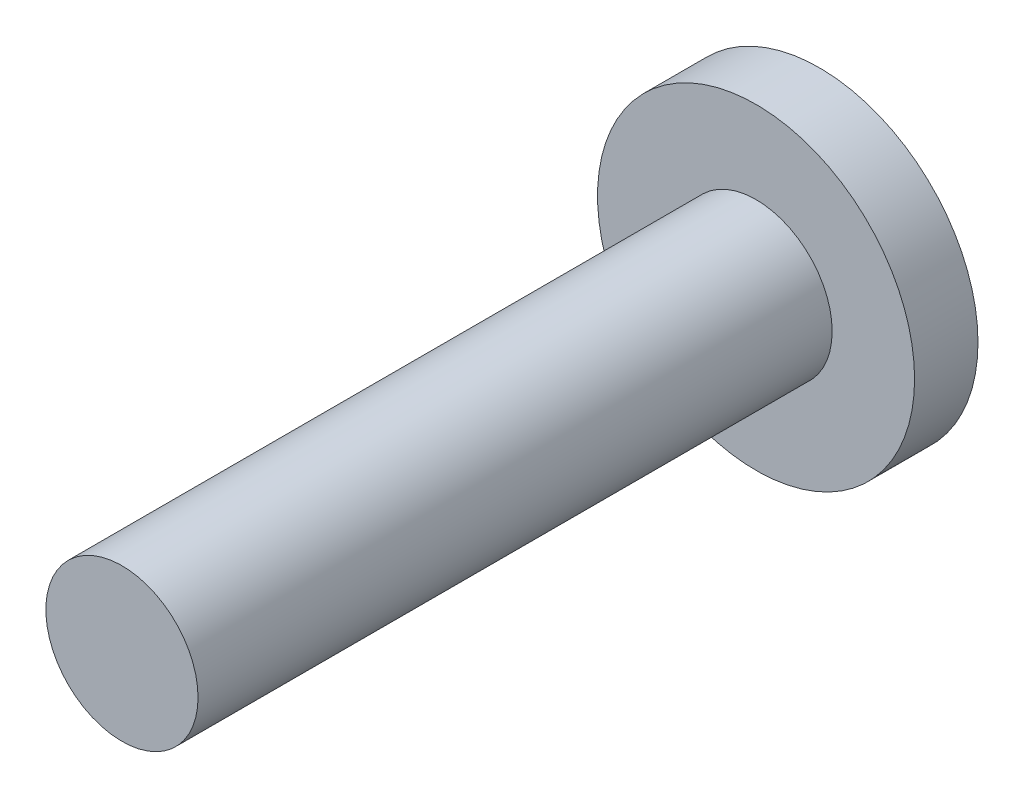
ISO-10303-21;
HEADER;
FILE_DESCRIPTION(('STEP AP214'),'2;1');
FILE_NAME('part.step','',(''),(''),'','','');
FILE_SCHEMA(('AUTOMOTIVE_DESIGN { 1 0 10303 214 1 1 1 1 }'));
ENDSEC;
DATA;
#1=APPLICATION_CONTEXT('core data for automotive mechanical design processes');
#2=APPLICATION_PROTOCOL_DEFINITION('international standard','automotive_design',2000,#1);
#3=PRODUCT_CONTEXT('',#1,'mechanical');
#4=PRODUCT('Part','Part','',(#3));
#5=PRODUCT_RELATED_PRODUCT_CATEGORY('part','',(#4));
#6=PRODUCT_DEFINITION_FORMATION('','',#4);
#7=PRODUCT_DEFINITION_CONTEXT('part definition',#1,'design');
#8=PRODUCT_DEFINITION('design','',#6,#7);
#9=PRODUCT_DEFINITION_SHAPE('','',#8);
#10=(LENGTH_UNIT() NAMED_UNIT(*) SI_UNIT(.MILLI.,.METRE.));
#11=(NAMED_UNIT(*) PLANE_ANGLE_UNIT() SI_UNIT($,.RADIAN.));
#12=(NAMED_UNIT(*) SI_UNIT($,.STERADIAN.) SOLID_ANGLE_UNIT());
#13=UNCERTAINTY_MEASURE_WITH_UNIT(LENGTH_MEASURE(1.E-05),#10,'distance_accuracy_value','');
#14=(GEOMETRIC_REPRESENTATION_CONTEXT(3) GLOBAL_UNCERTAINTY_ASSIGNED_CONTEXT((#13)) GLOBAL_UNIT_ASSIGNED_CONTEXT((#10,
#11,#12)) REPRESENTATION_CONTEXT('',''));
#15=CARTESIAN_POINT('',(0.,0.,0.));
#16=DIRECTION('',(0.,0.,1.));
#17=DIRECTION('',(1.,0.,0.));
#18=AXIS2_PLACEMENT_3D('',#15,#16,#17);
#19=CARTESIAN_POINT('',(0.,0.,2.5));
#20=DIRECTION('',(0.,0.,-1.));
#21=DIRECTION('',(-1.,0.,0.));
#22=AXIS2_PLACEMENT_3D('',#19,#20,#21);
#23=CYLINDRICAL_SURFACE('',#22,6.25);
#24=CARTESIAN_POINT('',(0.,0.,2.5));
#25=DIRECTION('',(0.,0.,1.));
#26=DIRECTION('',(1.,0.,0.));
#27=AXIS2_PLACEMENT_3D('',#24,#25,#26);
#28=CIRCLE('',#27,6.25);
#29=CARTESIAN_POINT('',(6.25,0.,2.5));
#30=VERTEX_POINT('',#29);
#31=EDGE_CURVE('E48',#30,#30,#28,.T.);
#32=ORIENTED_EDGE('',*,*,#31,.F.);
#33=EDGE_LOOP('',(#32));
#34=FACE_BOUND('',#33,.T.);
#35=CARTESIAN_POINT('',(0.,0.,0.));
#36=DIRECTION('',(0.,0.,1.));
#37=DIRECTION('',(1.,0.,0.));
#38=AXIS2_PLACEMENT_3D('',#35,#36,#37);
#39=CIRCLE('',#38,6.25);
#40=CARTESIAN_POINT('',(6.25,0.,0.));
#41=VERTEX_POINT('',#40);
#42=EDGE_CURVE('E43',#41,#41,#39,.T.);
#43=ORIENTED_EDGE('',*,*,#42,.T.);
#44=EDGE_LOOP('',(#43));
#45=FACE_BOUND('',#44,.T.);
#46=ADVANCED_FACE('F40',(#34,#45),#23,.T.);
#47=CARTESIAN_POINT('',(0.,0.,2.5));
#48=DIRECTION('',(0.,0.,1.));
#49=DIRECTION('',(1.,0.,0.));
#50=AXIS2_PLACEMENT_3D('',#47,#48,#49);
#51=PLANE('',#50);
#52=CARTESIAN_POINT('',(0.,0.,2.5));
#53=DIRECTION('',(0.,0.,1.));
#54=DIRECTION('',(1.,0.,0.));
#55=AXIS2_PLACEMENT_3D('',#52,#53,#54);
#56=CIRCLE('',#55,3.);
#57=CARTESIAN_POINT('',(3.,0.,2.5));
#58=VERTEX_POINT('',#57);
#59=EDGE_CURVE('E11',#58,#58,#56,.T.);
#60=ORIENTED_EDGE('',*,*,#59,.F.);
#61=EDGE_LOOP('',(#60));
#62=FACE_BOUND('',#61,.T.);
#63=ORIENTED_EDGE('',*,*,#31,.T.);
#64=EDGE_LOOP('',(#63));
#65=FACE_BOUND('',#64,.T.);
#66=ADVANCED_FACE('F160',(#62,#65),#51,.T.);
#67=CARTESIAN_POINT('',(0.,0.,0.));
#68=DIRECTION('',(0.,0.,1.));
#69=DIRECTION('',(1.,0.,0.));
#70=AXIS2_PLACEMENT_3D('',#67,#68,#69);
#71=PLANE('',#70);
#72=DIRECTION('',(0.5,0.866025403784439,0.));
#73=VECTOR('',#72,1.);
#74=CARTESIAN_POINT('',(-2.3094010767585,0.,0.));
#75=LINE('',#74,#73);
#76=CARTESIAN_POINT('',(-2.3094010767585,0.,0.));
#77=VERTEX_POINT('',#76);
#78=CARTESIAN_POINT('',(-1.15470053837925,2.,0.));
#79=VERTEX_POINT('',#78);
#80=EDGE_CURVE('E130',#77,#79,#75,.T.);
#81=ORIENTED_EDGE('',*,*,#80,.F.);
#82=DIRECTION('',(-0.5,0.866025403784439,0.));
#83=VECTOR('',#82,1.);
#84=CARTESIAN_POINT('',(-1.15470053837925,-2.,0.));
#85=LINE('',#84,#83);
#86=CARTESIAN_POINT('',(-1.15470053837925,-2.,0.));
#87=VERTEX_POINT('',#86);
#88=EDGE_CURVE('E56',#87,#77,#85,.T.);
#89=ORIENTED_EDGE('',*,*,#88,.F.);
#90=DIRECTION('',(-1.,0.,0.));
#91=VECTOR('',#90,1.);
#92=CARTESIAN_POINT('',(1.15470053837925,-2.,0.));
#93=LINE('',#92,#91);
#94=CARTESIAN_POINT('',(1.15470053837925,-2.,0.));
#95=VERTEX_POINT('',#94);
#96=EDGE_CURVE('E139',#95,#87,#93,.T.);
#97=ORIENTED_EDGE('',*,*,#96,.F.);
#98=DIRECTION('',(-0.5,-0.866025403784439,0.));
#99=VECTOR('',#98,1.);
#100=CARTESIAN_POINT('',(2.3094010767585,0.,0.));
#101=LINE('',#100,#99);
#102=CARTESIAN_POINT('',(2.3094010767585,0.,0.));
#103=VERTEX_POINT('',#102);
#104=EDGE_CURVE('E137',#103,#95,#101,.T.);
#105=ORIENTED_EDGE('',*,*,#104,.F.);
#106=DIRECTION('',(0.5,-0.866025403784439,0.));
#107=VECTOR('',#106,1.);
#108=CARTESIAN_POINT('',(1.15470053837925,2.,0.));
#109=LINE('',#108,#107);
#110=CARTESIAN_POINT('',(1.15470053837925,2.,0.));
#111=VERTEX_POINT('',#110);
#112=EDGE_CURVE('E104',#111,#103,#109,.T.);
#113=ORIENTED_EDGE('',*,*,#112,.F.);
#114=DIRECTION('',(1.,0.,0.));
#115=VECTOR('',#114,1.);
#116=CARTESIAN_POINT('',(-1.15470053837925,2.,0.));
#117=LINE('',#116,#115);
#118=EDGE_CURVE('E133',#79,#111,#117,.T.);
#119=ORIENTED_EDGE('',*,*,#118,.F.);
#120=EDGE_LOOP('',(#81,#89,#97,#105,#113,#119));
#121=FACE_BOUND('',#120,.T.);
#122=ORIENTED_EDGE('',*,*,#42,.F.);
#123=EDGE_LOOP('',(#122));
#124=FACE_BOUND('',#123,.T.);
#125=ADVANCED_FACE('F157',(#121,#124),#71,.F.);
#126=CARTESIAN_POINT('',(0.,0.,27.5));
#127=DIRECTION('',(0.,0.,-1.));
#128=DIRECTION('',(-1.,0.,0.));
#129=AXIS2_PLACEMENT_3D('',#126,#127,#128);
#130=CYLINDRICAL_SURFACE('',#129,3.);
#131=CARTESIAN_POINT('',(0.,0.,27.5));
#132=DIRECTION('',(0.,0.,1.));
#133=DIRECTION('',(1.,0.,0.));
#134=AXIS2_PLACEMENT_3D('',#131,#132,#133);
#135=CIRCLE('',#134,3.);
#136=CARTESIAN_POINT('',(3.,0.,27.5));
#137=VERTEX_POINT('',#136);
#138=EDGE_CURVE('E143',#137,#137,#135,.T.);
#139=ORIENTED_EDGE('',*,*,#138,.F.);
#140=EDGE_LOOP('',(#139));
#141=FACE_BOUND('',#140,.T.);
#142=ORIENTED_EDGE('',*,*,#59,.T.);
#143=EDGE_LOOP('',(#142));
#144=FACE_BOUND('',#143,.T.);
#145=ADVANCED_FACE('F159',(#141,#144),#130,.T.);
#146=CARTESIAN_POINT('',(0.,0.,27.5));
#147=DIRECTION('',(0.,0.,1.));
#148=DIRECTION('',(1.,0.,0.));
#149=AXIS2_PLACEMENT_3D('',#146,#147,#148);
#150=PLANE('',#149);
#151=ORIENTED_EDGE('',*,*,#138,.T.);
#152=EDGE_LOOP('',(#151));
#153=FACE_BOUND('',#152,.T.);
#154=ADVANCED_FACE('F167',(#153),#150,.T.);
#155=CARTESIAN_POINT('',(-1.15470053837925,-2.,1.));
#156=DIRECTION('',(-0.866025403784439,-0.5,0.));
#157=DIRECTION('',(0.5,-0.866025403784439,0.));
#158=AXIS2_PLACEMENT_3D('',#155,#156,#157);
#159=PLANE('',#158);
#160=ORIENTED_EDGE('',*,*,#88,.T.);
#161=DIRECTION('',(0.,0.,-1.));
#162=VECTOR('',#161,1.);
#163=CARTESIAN_POINT('',(-2.3094010767585,0.,1.));
#164=LINE('',#163,#162);
#165=CARTESIAN_POINT('',(-2.3094010767585,0.,1.));
#166=VERTEX_POINT('',#165);
#167=EDGE_CURVE('E86',#166,#77,#164,.T.);
#168=ORIENTED_EDGE('',*,*,#167,.F.);
#169=DIRECTION('',(-0.5,0.866025403784439,0.));
#170=VECTOR('',#169,1.);
#171=CARTESIAN_POINT('',(-1.15470053837925,-2.,1.));
#172=LINE('',#171,#170);
#173=CARTESIAN_POINT('',(-1.15470053837925,-2.,1.));
#174=VERTEX_POINT('',#173);
#175=EDGE_CURVE('E141',#174,#166,#172,.T.);
#176=ORIENTED_EDGE('',*,*,#175,.F.);
#177=DIRECTION('',(0.,0.,-1.));
#178=VECTOR('',#177,1.);
#179=CARTESIAN_POINT('',(-1.15470053837925,-2.,1.));
#180=LINE('',#179,#178);
#181=EDGE_CURVE('E64',#174,#87,#180,.T.);
#182=ORIENTED_EDGE('',*,*,#181,.T.);
#183=EDGE_LOOP('',(#160,#168,#176,#182));
#184=FACE_BOUND('',#183,.T.);
#185=ADVANCED_FACE('F193',(#184),#159,.F.);
#186=CARTESIAN_POINT('',(1.15470053837925,-2.,1.));
#187=DIRECTION('',(0.,-1.,0.));
#188=DIRECTION('',(0.,0.,-1.));
#189=AXIS2_PLACEMENT_3D('',#186,#187,#188);
#190=PLANE('',#189);
#191=ORIENTED_EDGE('',*,*,#96,.T.);
#192=ORIENTED_EDGE('',*,*,#181,.F.);
#193=DIRECTION('',(-1.,0.,0.));
#194=VECTOR('',#193,1.);
#195=CARTESIAN_POINT('',(1.15470053837925,-2.,1.));
#196=LINE('',#195,#194);
#197=CARTESIAN_POINT('',(1.15470053837925,-2.,1.));
#198=VERTEX_POINT('',#197);
#199=EDGE_CURVE('E116',#198,#174,#196,.T.);
#200=ORIENTED_EDGE('',*,*,#199,.F.);
#201=DIRECTION('',(0.,0.,-1.));
#202=VECTOR('',#201,1.);
#203=CARTESIAN_POINT('',(1.15470053837925,-2.,1.));
#204=LINE('',#203,#202);
#205=EDGE_CURVE('E108',#198,#95,#204,.T.);
#206=ORIENTED_EDGE('',*,*,#205,.T.);
#207=EDGE_LOOP('',(#191,#192,#200,#206));
#208=FACE_BOUND('',#207,.T.);
#209=ADVANCED_FACE('F205',(#208),#190,.F.);
#210=CARTESIAN_POINT('',(2.3094010767585,0.,1.));
#211=DIRECTION('',(0.866025403784439,-0.5,0.));
#212=DIRECTION('',(0.5,0.866025403784439,0.));
#213=AXIS2_PLACEMENT_3D('',#210,#211,#212);
#214=PLANE('',#213);
#215=ORIENTED_EDGE('',*,*,#104,.T.);
#216=ORIENTED_EDGE('',*,*,#205,.F.);
#217=DIRECTION('',(-0.5,-0.866025403784439,0.));
#218=VECTOR('',#217,1.);
#219=CARTESIAN_POINT('',(2.3094010767585,0.,1.));
#220=LINE('',#219,#218);
#221=CARTESIAN_POINT('',(2.3094010767585,0.,1.));
#222=VERTEX_POINT('',#221);
#223=EDGE_CURVE('E112',#222,#198,#220,.T.);
#224=ORIENTED_EDGE('',*,*,#223,.F.);
#225=DIRECTION('',(0.,0.,-1.));
#226=VECTOR('',#225,1.);
#227=CARTESIAN_POINT('',(2.3094010767585,0.,1.));
#228=LINE('',#227,#226);
#229=EDGE_CURVE('E97',#222,#103,#228,.T.);
#230=ORIENTED_EDGE('',*,*,#229,.T.);
#231=EDGE_LOOP('',(#215,#216,#224,#230));
#232=FACE_BOUND('',#231,.T.);
#233=ADVANCED_FACE('F113',(#232),#214,.F.);
#234=CARTESIAN_POINT('',(1.15470053837925,2.,1.));
#235=DIRECTION('',(0.866025403784439,0.5,0.));
#236=DIRECTION('',(-0.5,0.866025403784439,0.));
#237=AXIS2_PLACEMENT_3D('',#234,#235,#236);
#238=PLANE('',#237);
#239=ORIENTED_EDGE('',*,*,#112,.T.);
#240=ORIENTED_EDGE('',*,*,#229,.F.);
#241=DIRECTION('',(0.5,-0.866025403784439,0.));
#242=VECTOR('',#241,1.);
#243=CARTESIAN_POINT('',(1.15470053837925,2.,1.));
#244=LINE('',#243,#242);
#245=CARTESIAN_POINT('',(1.15470053837925,2.,1.));
#246=VERTEX_POINT('',#245);
#247=EDGE_CURVE('E101',#246,#222,#244,.T.);
#248=ORIENTED_EDGE('',*,*,#247,.F.);
#249=DIRECTION('',(0.,0.,-1.));
#250=VECTOR('',#249,1.);
#251=CARTESIAN_POINT('',(1.15470053837925,2.,1.));
#252=LINE('',#251,#250);
#253=EDGE_CURVE('E109',#246,#111,#252,.T.);
#254=ORIENTED_EDGE('',*,*,#253,.T.);
#255=EDGE_LOOP('',(#239,#240,#248,#254));
#256=FACE_BOUND('',#255,.T.);
#257=ADVANCED_FACE('F99',(#256),#238,.F.);
#258=CARTESIAN_POINT('',(-1.15470053837925,2.,1.));
#259=DIRECTION('',(0.,1.,0.));
#260=DIRECTION('',(-1.,0.,0.));
#261=AXIS2_PLACEMENT_3D('',#258,#259,#260);
#262=PLANE('',#261);
#263=ORIENTED_EDGE('',*,*,#118,.T.);
#264=ORIENTED_EDGE('',*,*,#253,.F.);
#265=DIRECTION('',(1.,0.,0.));
#266=VECTOR('',#265,1.);
#267=CARTESIAN_POINT('',(-1.15470053837925,2.,1.));
#268=LINE('',#267,#266);
#269=CARTESIAN_POINT('',(-1.15470053837925,2.,1.));
#270=VERTEX_POINT('',#269);
#271=EDGE_CURVE('E122',#270,#246,#268,.T.);
#272=ORIENTED_EDGE('',*,*,#271,.F.);
#273=DIRECTION('',(0.,0.,-1.));
#274=VECTOR('',#273,1.);
#275=CARTESIAN_POINT('',(-1.15470053837925,2.,1.));
#276=LINE('',#275,#274);
#277=EDGE_CURVE('E146',#270,#79,#276,.T.);
#278=ORIENTED_EDGE('',*,*,#277,.T.);
#279=EDGE_LOOP('',(#263,#264,#272,#278));
#280=FACE_BOUND('',#279,.T.);
#281=ADVANCED_FACE('F230',(#280),#262,.F.);
#282=CARTESIAN_POINT('',(-2.3094010767585,0.,1.));
#283=DIRECTION('',(-0.866025403784439,0.5,0.));
#284=DIRECTION('',(-0.5,-0.866025403784439,0.));
#285=AXIS2_PLACEMENT_3D('',#282,#283,#284);
#286=PLANE('',#285);
#287=ORIENTED_EDGE('',*,*,#80,.T.);
#288=ORIENTED_EDGE('',*,*,#277,.F.);
#289=DIRECTION('',(0.5,0.866025403784439,0.));
#290=VECTOR('',#289,1.);
#291=CARTESIAN_POINT('',(-2.3094010767585,0.,1.));
#292=LINE('',#291,#290);
#293=EDGE_CURVE('E124',#166,#270,#292,.T.);
#294=ORIENTED_EDGE('',*,*,#293,.F.);
#295=ORIENTED_EDGE('',*,*,#167,.T.);
#296=EDGE_LOOP('',(#287,#288,#294,#295));
#297=FACE_BOUND('',#296,.T.);
#298=ADVANCED_FACE('F239',(#297),#286,.F.);
#299=CARTESIAN_POINT('',(0.,0.,1.));
#300=DIRECTION('',(0.,0.,-1.));
#301=DIRECTION('',(-1.,0.,0.));
#302=AXIS2_PLACEMENT_3D('',#299,#300,#301);
#303=PLANE('',#302);
#304=ORIENTED_EDGE('',*,*,#175,.T.);
#305=ORIENTED_EDGE('',*,*,#293,.T.);
#306=ORIENTED_EDGE('',*,*,#271,.T.);
#307=ORIENTED_EDGE('',*,*,#247,.T.);
#308=ORIENTED_EDGE('',*,*,#223,.T.);
#309=ORIENTED_EDGE('',*,*,#199,.T.);
#310=EDGE_LOOP('',(#304,#305,#306,#307,#308,#309));
#311=FACE_BOUND('',#310,.T.);
#312=ADVANCED_FACE('F119',(#311),#303,.T.);
#313=CLOSED_SHELL('',(#46,#66,#125,#145,#154,#185,#209,#233,#257,#281,#298,#312));
#314=MANIFOLD_SOLID_BREP('B2',#313);
#315=ADVANCED_BREP_SHAPE_REPRESENTATION('',(#18,#314),#14);
#316=SHAPE_DEFINITION_REPRESENTATION(#9,#315);
ENDSEC;
END-ISO-10303-21;
